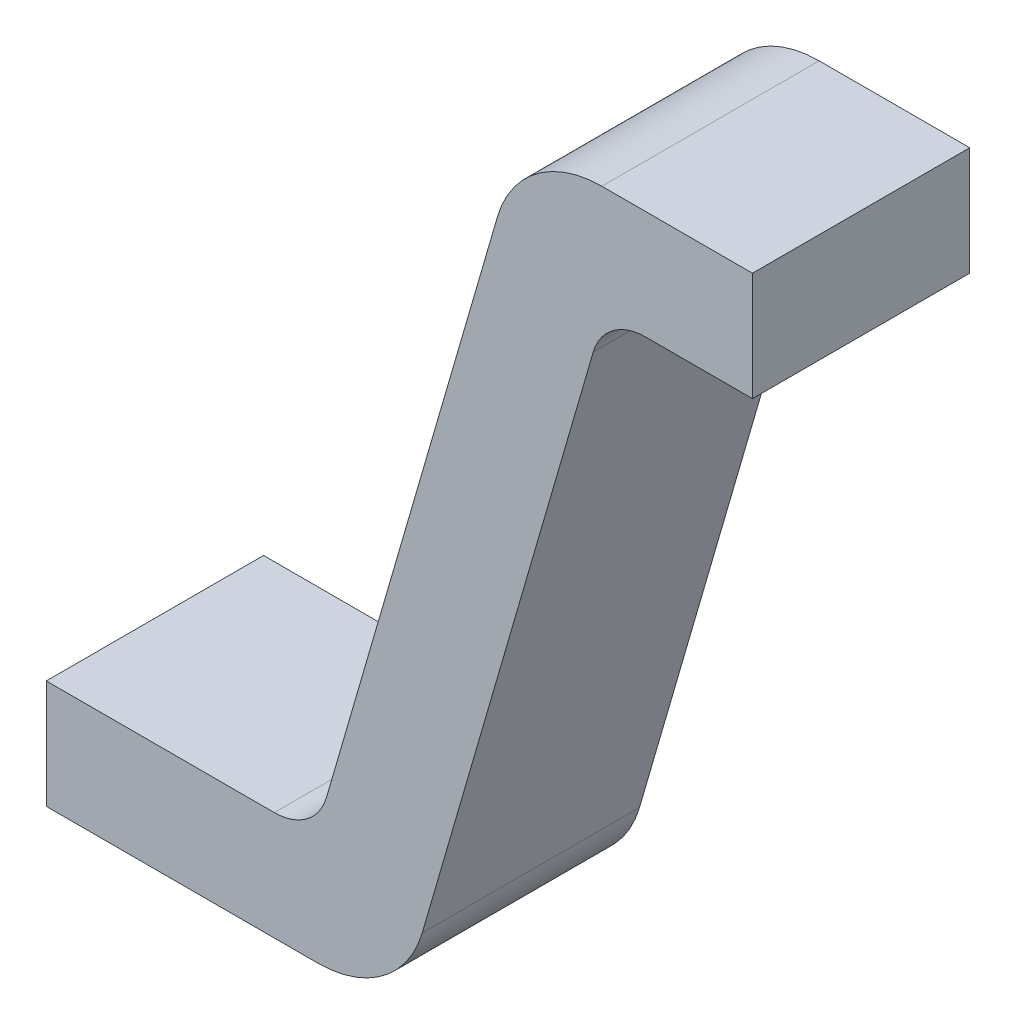
ISO-10303-21;
HEADER;
FILE_DESCRIPTION(('STEP AP214'),'2;1');
FILE_NAME('part.step','',(''),(''),'','','');
FILE_SCHEMA(('AUTOMOTIVE_DESIGN { 1 0 10303 214 1 1 1 1 }'));
ENDSEC;
DATA;
#1=APPLICATION_CONTEXT('core data for automotive mechanical design processes');
#2=APPLICATION_PROTOCOL_DEFINITION('international standard','automotive_design',2000,#1);
#3=PRODUCT_CONTEXT('',#1,'mechanical');
#4=PRODUCT('Part','Part','',(#3));
#5=PRODUCT_RELATED_PRODUCT_CATEGORY('part','',(#4));
#6=PRODUCT_DEFINITION_FORMATION('','',#4);
#7=PRODUCT_DEFINITION_CONTEXT('part definition',#1,'design');
#8=PRODUCT_DEFINITION('design','',#6,#7);
#9=PRODUCT_DEFINITION_SHAPE('','',#8);
#10=(LENGTH_UNIT() NAMED_UNIT(*) SI_UNIT(.MILLI.,.METRE.));
#11=(NAMED_UNIT(*) PLANE_ANGLE_UNIT() SI_UNIT($,.RADIAN.));
#12=(NAMED_UNIT(*) SI_UNIT($,.STERADIAN.) SOLID_ANGLE_UNIT());
#13=UNCERTAINTY_MEASURE_WITH_UNIT(LENGTH_MEASURE(1.E-05),#10,'distance_accuracy_value','');
#14=(GEOMETRIC_REPRESENTATION_CONTEXT(3) GLOBAL_UNCERTAINTY_ASSIGNED_CONTEXT((#13)) GLOBAL_UNIT_ASSIGNED_CONTEXT((#10,
#11,#12)) REPRESENTATION_CONTEXT('',''));
#15=CARTESIAN_POINT('',(0.,0.,0.));
#16=DIRECTION('',(0.,0.,1.));
#17=DIRECTION('',(1.,0.,0.));
#18=AXIS2_PLACEMENT_3D('',#15,#16,#17);
#19=CARTESIAN_POINT('',(0.419807135826594,0.3,0.));
#20=DIRECTION('',(0.,0.,-1.));
#21=DIRECTION('',(-1.,0.,0.));
#22=AXIS2_PLACEMENT_3D('',#19,#20,#21);
#23=PLANE('',#22);
#24=DIRECTION('',(0.,1.,0.));
#25=VECTOR('',#24,1.);
#26=CARTESIAN_POINT('',(0.,0.2,0.));
#27=LINE('',#26,#25);
#28=CARTESIAN_POINT('',(0.,0.,0.));
#29=VERTEX_POINT('',#28);
#30=CARTESIAN_POINT('',(0.,0.2,0.));
#31=VERTEX_POINT('',#30);
#32=EDGE_CURVE('E122',#29,#31,#27,.T.);
#33=ORIENTED_EDGE('',*,*,#32,.T.);
#34=DIRECTION('',(1.,0.,0.));
#35=VECTOR('',#34,1.);
#36=CARTESIAN_POINT('',(0.419807135826594,0.2,0.));
#37=LINE('',#36,#35);
#38=CARTESIAN_POINT('',(0.419807135826594,0.2,0.));
#39=VERTEX_POINT('',#38);
#40=EDGE_CURVE('E116',#31,#39,#37,.T.);
#41=ORIENTED_EDGE('',*,*,#40,.T.);
#42=CARTESIAN_POINT('',(0.419807135826594,0.3,0.));
#43=DIRECTION('',(0.,0.,-1.));
#44=DIRECTION('',(-1.,0.,0.));
#45=AXIS2_PLACEMENT_3D('',#42,#43,#44);
#46=CIRCLE('',#45,0.1);
#47=CARTESIAN_POINT('',(0.515835065958369,0.272095938743494,0.));
#48=VERTEX_POINT('',#47);
#49=EDGE_CURVE('E103',#39,#48,#46,.F.);
#50=ORIENTED_EDGE('',*,*,#49,.T.);
#51=DIRECTION('',(0.279040612565064,0.960279301317754,0.));
#52=VECTOR('',#51,1.);
#53=CARTESIAN_POINT('',(0.830743146543152,1.35580812251301,0.));
#54=LINE('',#53,#52);
#55=CARTESIAN_POINT('',(0.830743146543152,1.35580812251301,0.));
#56=VERTEX_POINT('',#55);
#57=EDGE_CURVE('E100',#48,#56,#54,.T.);
#58=ORIENTED_EDGE('',*,*,#57,.T.);
#59=CARTESIAN_POINT('',(1.0227990068067,1.3,0.));
#60=DIRECTION('',(0.,0.,-1.));
#61=DIRECTION('',(-1.,0.,0.));
#62=AXIS2_PLACEMENT_3D('',#59,#60,#61);
#63=CIRCLE('',#62,0.2);
#64=CARTESIAN_POINT('',(1.0227990068067,1.5,0.));
#65=VERTEX_POINT('',#64);
#66=EDGE_CURVE('E19',#65,#56,#63,.F.);
#67=ORIENTED_EDGE('',*,*,#66,.F.);
#68=DIRECTION('',(1.,0.,0.));
#69=VECTOR('',#68,1.);
#70=CARTESIAN_POINT('',(1.3,1.5,0.));
#71=LINE('',#70,#69);
#72=CARTESIAN_POINT('',(1.3,1.5,0.));
#73=VERTEX_POINT('',#72);
#74=EDGE_CURVE('E112',#65,#73,#71,.T.);
#75=ORIENTED_EDGE('',*,*,#74,.T.);
#76=DIRECTION('',(0.,1.,0.));
#77=VECTOR('',#76,1.);
#78=CARTESIAN_POINT('',(1.3,1.3,0.));
#79=LINE('',#78,#77);
#80=CARTESIAN_POINT('',(1.3,1.3,0.));
#81=VERTEX_POINT('',#80);
#82=EDGE_CURVE('E144',#73,#81,#79,.F.);
#83=ORIENTED_EDGE('',*,*,#82,.T.);
#84=DIRECTION('',(1.,0.,0.));
#85=VECTOR('',#84,1.);
#86=CARTESIAN_POINT('',(1.10299187098011,1.3,0.));
#87=LINE('',#86,#85);
#88=CARTESIAN_POINT('',(1.10299187098011,1.3,0.));
#89=VERTEX_POINT('',#88);
#90=EDGE_CURVE('E138',#81,#89,#87,.F.);
#91=ORIENTED_EDGE('',*,*,#90,.T.);
#92=CARTESIAN_POINT('',(1.10299187098011,1.2,0.));
#93=DIRECTION('',(0.,0.,-1.));
#94=DIRECTION('',(-1.,0.,0.));
#95=AXIS2_PLACEMENT_3D('',#92,#93,#94);
#96=CIRCLE('',#95,0.1);
#97=CARTESIAN_POINT('',(1.00696394084833,1.22790406125651,0.));
#98=VERTEX_POINT('',#97);
#99=EDGE_CURVE('E167',#89,#98,#96,.F.);
#100=ORIENTED_EDGE('',*,*,#99,.T.);
#101=DIRECTION('',(-0.279040612565064,-0.960279301317754,0.));
#102=VECTOR('',#101,1.);
#103=CARTESIAN_POINT('',(0.692055860263551,0.144191877486987,0.));
#104=LINE('',#103,#102);
#105=CARTESIAN_POINT('',(0.692055860263551,0.144191877486987,0.));
#106=VERTEX_POINT('',#105);
#107=EDGE_CURVE('E133',#98,#106,#104,.T.);
#108=ORIENTED_EDGE('',*,*,#107,.T.);
#109=CARTESIAN_POINT('',(0.5,0.2,0.));
#110=DIRECTION('',(0.,0.,-1.));
#111=DIRECTION('',(-1.,0.,0.));
#112=AXIS2_PLACEMENT_3D('',#109,#110,#111);
#113=CIRCLE('',#112,0.2);
#114=CARTESIAN_POINT('',(0.5,0.,0.));
#115=VERTEX_POINT('',#114);
#116=EDGE_CURVE('E136',#115,#106,#113,.F.);
#117=ORIENTED_EDGE('',*,*,#116,.F.);
#118=DIRECTION('',(1.,0.,0.));
#119=VECTOR('',#118,1.);
#120=CARTESIAN_POINT('',(0.,0.,0.));
#121=LINE('',#120,#119);
#122=EDGE_CURVE('E127',#115,#29,#121,.F.);
#123=ORIENTED_EDGE('',*,*,#122,.T.);
#124=EDGE_LOOP('',(#33,#41,#50,#58,#67,#75,#83,#91,#100,#108,#117,#123));
#125=FACE_BOUND('',#124,.T.);
#126=ADVANCED_FACE('F16',(#125),#23,.T.);
#127=CARTESIAN_POINT('',(0.830743146543152,1.35580812251301,0.4));
#128=DIRECTION('',(0.960279301317754,-0.279040612565064,0.));
#129=DIRECTION('',(0.279040612565064,0.960279301317754,0.));
#130=AXIS2_PLACEMENT_3D('',#127,#128,#129);
#131=PLANE('',#130);
#132=DIRECTION('',(0.,0.,-1.));
#133=VECTOR('',#132,1.);
#134=CARTESIAN_POINT('',(0.515835065958369,0.272095938743494,0.4));
#135=LINE('',#134,#133);
#136=CARTESIAN_POINT('',(0.515835065958369,0.272095938743494,0.4));
#137=VERTEX_POINT('',#136);
#138=EDGE_CURVE('E118',#48,#137,#135,.F.);
#139=ORIENTED_EDGE('',*,*,#138,.T.);
#140=DIRECTION('',(0.279040612565064,0.960279301317754,0.));
#141=VECTOR('',#140,1.);
#142=CARTESIAN_POINT('',(0.515835065958369,0.272095938743494,0.4));
#143=LINE('',#142,#141);
#144=CARTESIAN_POINT('',(0.830743146543152,1.35580812251301,0.4));
#145=VERTEX_POINT('',#144);
#146=EDGE_CURVE('E110',#137,#145,#143,.T.);
#147=ORIENTED_EDGE('',*,*,#146,.T.);
#148=DIRECTION('',(0.,0.,-1.));
#149=VECTOR('',#148,1.);
#150=CARTESIAN_POINT('',(0.830743146543152,1.35580812251301,0.4));
#151=LINE('',#150,#149);
#152=EDGE_CURVE('E97',#56,#145,#151,.F.);
#153=ORIENTED_EDGE('',*,*,#152,.F.);
#154=ORIENTED_EDGE('',*,*,#57,.F.);
#155=EDGE_LOOP('',(#139,#147,#153,#154));
#156=FACE_BOUND('',#155,.T.);
#157=ADVANCED_FACE('F109',(#156),#131,.F.);
#158=CARTESIAN_POINT('',(1.0227990068067,1.3,0.4));
#159=DIRECTION('',(0.,0.,-1.));
#160=DIRECTION('',(-1.,0.,0.));
#161=AXIS2_PLACEMENT_3D('',#158,#159,#160);
#162=CYLINDRICAL_SURFACE('',#161,0.2);
#163=CARTESIAN_POINT('',(1.0227990068067,1.3,0.4));
#164=DIRECTION('',(0.,0.,-1.));
#165=DIRECTION('',(-1.,0.,0.));
#166=AXIS2_PLACEMENT_3D('',#163,#164,#165);
#167=CIRCLE('',#166,0.2);
#168=CARTESIAN_POINT('',(1.0227990068067,1.5,0.4));
#169=VERTEX_POINT('',#168);
#170=EDGE_CURVE('E162',#145,#169,#167,.T.);
#171=ORIENTED_EDGE('',*,*,#170,.T.);
#172=DIRECTION('',(0.,0.,-1.));
#173=VECTOR('',#172,1.);
#174=CARTESIAN_POINT('',(1.0227990068067,1.5,0.4));
#175=LINE('',#174,#173);
#176=EDGE_CURVE('E99',#169,#65,#175,.T.);
#177=ORIENTED_EDGE('',*,*,#176,.T.);
#178=ORIENTED_EDGE('',*,*,#66,.T.);
#179=ORIENTED_EDGE('',*,*,#152,.T.);
#180=EDGE_LOOP('',(#171,#177,#178,#179));
#181=FACE_BOUND('',#180,.T.);
#182=ADVANCED_FACE('F95',(#181),#162,.T.);
#183=CARTESIAN_POINT('',(1.3,1.5,0.4));
#184=DIRECTION('',(0.,-1.,0.));
#185=DIRECTION('',(0.,0.,-1.));
#186=AXIS2_PLACEMENT_3D('',#183,#184,#185);
#187=PLANE('',#186);
#188=ORIENTED_EDGE('',*,*,#176,.F.);
#189=DIRECTION('',(-1.,0.,0.));
#190=VECTOR('',#189,1.);
#191=CARTESIAN_POINT('',(0.419807135826594,1.5,0.4));
#192=LINE('',#191,#190);
#193=CARTESIAN_POINT('',(1.3,1.5,0.4));
#194=VERTEX_POINT('',#193);
#195=EDGE_CURVE('E164',#169,#194,#192,.F.);
#196=ORIENTED_EDGE('',*,*,#195,.T.);
#197=DIRECTION('',(0.,0.,1.));
#198=VECTOR('',#197,1.);
#199=CARTESIAN_POINT('',(1.3,1.5,0.4));
#200=LINE('',#199,#198);
#201=EDGE_CURVE('E147',#194,#73,#200,.F.);
#202=ORIENTED_EDGE('',*,*,#201,.T.);
#203=ORIENTED_EDGE('',*,*,#74,.F.);
#204=EDGE_LOOP('',(#188,#196,#202,#203));
#205=FACE_BOUND('',#204,.T.);
#206=ADVANCED_FACE('F193',(#205),#187,.F.);
#207=CARTESIAN_POINT('',(1.3,1.3,0.4));
#208=DIRECTION('',(-1.,0.,0.));
#209=DIRECTION('',(0.,0.,1.));
#210=AXIS2_PLACEMENT_3D('',#207,#208,#209);
#211=PLANE('',#210);
#212=ORIENTED_EDGE('',*,*,#201,.F.);
#213=DIRECTION('',(0.,1.,0.));
#214=VECTOR('',#213,1.);
#215=CARTESIAN_POINT('',(1.3,0.3,0.4));
#216=LINE('',#215,#214);
#217=CARTESIAN_POINT('',(1.3,1.3,0.4));
#218=VERTEX_POINT('',#217);
#219=EDGE_CURVE('E183',#194,#218,#216,.F.);
#220=ORIENTED_EDGE('',*,*,#219,.T.);
#221=DIRECTION('',(0.,0.,1.));
#222=VECTOR('',#221,1.);
#223=CARTESIAN_POINT('',(1.3,1.3,0.4));
#224=LINE('',#223,#222);
#225=EDGE_CURVE('E141',#218,#81,#224,.F.);
#226=ORIENTED_EDGE('',*,*,#225,.T.);
#227=ORIENTED_EDGE('',*,*,#82,.F.);
#228=EDGE_LOOP('',(#212,#220,#226,#227));
#229=FACE_BOUND('',#228,.T.);
#230=ADVANCED_FACE('F198',(#229),#211,.F.);
#231=CARTESIAN_POINT('',(1.10299187098011,1.3,0.4));
#232=DIRECTION('',(0.,1.,0.));
#233=DIRECTION('',(0.,0.,1.));
#234=AXIS2_PLACEMENT_3D('',#231,#232,#233);
#235=PLANE('',#234);
#236=ORIENTED_EDGE('',*,*,#225,.F.);
#237=DIRECTION('',(-1.,0.,0.));
#238=VECTOR('',#237,1.);
#239=CARTESIAN_POINT('',(0.419807135826594,1.3,0.4));
#240=LINE('',#239,#238);
#241=CARTESIAN_POINT('',(1.10299187098011,1.3,0.4));
#242=VERTEX_POINT('',#241);
#243=EDGE_CURVE('E161',#218,#242,#240,.T.);
#244=ORIENTED_EDGE('',*,*,#243,.T.);
#245=DIRECTION('',(0.,0.,-1.));
#246=VECTOR('',#245,1.);
#247=CARTESIAN_POINT('',(1.10299187098011,1.3,0.4));
#248=LINE('',#247,#246);
#249=EDGE_CURVE('E140',#242,#89,#248,.T.);
#250=ORIENTED_EDGE('',*,*,#249,.T.);
#251=ORIENTED_EDGE('',*,*,#90,.F.);
#252=EDGE_LOOP('',(#236,#244,#250,#251));
#253=FACE_BOUND('',#252,.T.);
#254=ADVANCED_FACE('F246',(#253),#235,.F.);
#255=CARTESIAN_POINT('',(1.10299187098011,1.2,0.4));
#256=DIRECTION('',(0.,0.,-1.));
#257=DIRECTION('',(-1.,0.,0.));
#258=AXIS2_PLACEMENT_3D('',#255,#256,#257);
#259=CYLINDRICAL_SURFACE('',#258,0.1);
#260=ORIENTED_EDGE('',*,*,#249,.F.);
#261=CARTESIAN_POINT('',(1.10299187098011,1.2,0.4));
#262=DIRECTION('',(0.,0.,-1.));
#263=DIRECTION('',(-1.,0.,0.));
#264=AXIS2_PLACEMENT_3D('',#261,#262,#263);
#265=CIRCLE('',#264,0.1);
#266=CARTESIAN_POINT('',(1.00696394084833,1.22790406125651,0.4));
#267=VERTEX_POINT('',#266);
#268=EDGE_CURVE('E158',#242,#267,#265,.F.);
#269=ORIENTED_EDGE('',*,*,#268,.T.);
#270=DIRECTION('',(0.,0.,1.));
#271=VECTOR('',#270,1.);
#272=CARTESIAN_POINT('',(1.00696394084833,1.22790406125651,0.4));
#273=LINE('',#272,#271);
#274=EDGE_CURVE('E137',#267,#98,#273,.F.);
#275=ORIENTED_EDGE('',*,*,#274,.T.);
#276=ORIENTED_EDGE('',*,*,#99,.F.);
#277=EDGE_LOOP('',(#260,#269,#275,#276));
#278=FACE_BOUND('',#277,.T.);
#279=ADVANCED_FACE('F244',(#278),#259,.F.);
#280=CARTESIAN_POINT('',(0.692055860263551,0.144191877486987,0.4));
#281=DIRECTION('',(-0.960279301317754,0.279040612565064,0.));
#282=DIRECTION('',(-0.279040612565064,-0.960279301317754,0.));
#283=AXIS2_PLACEMENT_3D('',#280,#281,#282);
#284=PLANE('',#283);
#285=ORIENTED_EDGE('',*,*,#274,.F.);
#286=DIRECTION('',(-0.279040612565064,-0.960279301317754,0.));
#287=VECTOR('',#286,1.);
#288=CARTESIAN_POINT('',(1.00696394084833,1.22790406125651,0.4));
#289=LINE('',#288,#287);
#290=CARTESIAN_POINT('',(0.692055860263551,0.144191877486987,0.4));
#291=VERTEX_POINT('',#290);
#292=EDGE_CURVE('E157',#267,#291,#289,.T.);
#293=ORIENTED_EDGE('',*,*,#292,.T.);
#294=DIRECTION('',(0.,0.,-1.));
#295=VECTOR('',#294,1.);
#296=CARTESIAN_POINT('',(0.692055860263551,0.144191877486987,0.4));
#297=LINE('',#296,#295);
#298=EDGE_CURVE('E166',#106,#291,#297,.F.);
#299=ORIENTED_EDGE('',*,*,#298,.F.);
#300=ORIENTED_EDGE('',*,*,#107,.F.);
#301=EDGE_LOOP('',(#285,#293,#299,#300));
#302=FACE_BOUND('',#301,.T.);
#303=ADVANCED_FACE('F242',(#302),#284,.F.);
#304=CARTESIAN_POINT('',(0.5,0.2,0.4));
#305=DIRECTION('',(0.,0.,-1.));
#306=DIRECTION('',(-1.,0.,0.));
#307=AXIS2_PLACEMENT_3D('',#304,#305,#306);
#308=CYLINDRICAL_SURFACE('',#307,0.2);
#309=CARTESIAN_POINT('',(0.5,0.2,0.4));
#310=DIRECTION('',(0.,0.,-1.));
#311=DIRECTION('',(-1.,0.,0.));
#312=AXIS2_PLACEMENT_3D('',#309,#310,#311);
#313=CIRCLE('',#312,0.2);
#314=CARTESIAN_POINT('',(0.5,0.,0.4));
#315=VERTEX_POINT('',#314);
#316=EDGE_CURVE('E153',#291,#315,#313,.T.);
#317=ORIENTED_EDGE('',*,*,#316,.T.);
#318=DIRECTION('',(0.,0.,1.));
#319=VECTOR('',#318,1.);
#320=CARTESIAN_POINT('',(0.5,0.,0.4));
#321=LINE('',#320,#319);
#322=EDGE_CURVE('E130',#315,#115,#321,.F.);
#323=ORIENTED_EDGE('',*,*,#322,.T.);
#324=ORIENTED_EDGE('',*,*,#116,.T.);
#325=ORIENTED_EDGE('',*,*,#298,.T.);
#326=EDGE_LOOP('',(#317,#323,#324,#325));
#327=FACE_BOUND('',#326,.T.);
#328=ADVANCED_FACE('F236',(#327),#308,.T.);
#329=CARTESIAN_POINT('',(0.,0.,0.4));
#330=DIRECTION('',(0.,1.,0.));
#331=DIRECTION('',(0.,0.,1.));
#332=AXIS2_PLACEMENT_3D('',#329,#330,#331);
#333=PLANE('',#332);
#334=ORIENTED_EDGE('',*,*,#322,.F.);
#335=DIRECTION('',(-1.,0.,0.));
#336=VECTOR('',#335,1.);
#337=CARTESIAN_POINT('',(0.419807135826594,0.,0.4));
#338=LINE('',#337,#336);
#339=CARTESIAN_POINT('',(0.,0.,0.4));
#340=VERTEX_POINT('',#339);
#341=EDGE_CURVE('E156',#315,#340,#338,.T.);
#342=ORIENTED_EDGE('',*,*,#341,.T.);
#343=DIRECTION('',(0.,0.,-1.));
#344=VECTOR('',#343,1.);
#345=CARTESIAN_POINT('',(0.,0.,0.4));
#346=LINE('',#345,#344);
#347=EDGE_CURVE('E124',#340,#29,#346,.T.);
#348=ORIENTED_EDGE('',*,*,#347,.T.);
#349=ORIENTED_EDGE('',*,*,#122,.F.);
#350=EDGE_LOOP('',(#334,#342,#348,#349));
#351=FACE_BOUND('',#350,.T.);
#352=ADVANCED_FACE('F270',(#351),#333,.F.);
#353=CARTESIAN_POINT('',(0.,0.2,0.4));
#354=DIRECTION('',(1.,0.,0.));
#355=DIRECTION('',(0.,0.,-1.));
#356=AXIS2_PLACEMENT_3D('',#353,#354,#355);
#357=PLANE('',#356);
#358=ORIENTED_EDGE('',*,*,#347,.F.);
#359=DIRECTION('',(0.,1.,0.));
#360=VECTOR('',#359,1.);
#361=CARTESIAN_POINT('',(0.,0.3,0.4));
#362=LINE('',#361,#360);
#363=CARTESIAN_POINT('',(0.,0.2,0.4));
#364=VERTEX_POINT('',#363);
#365=EDGE_CURVE('E223',#340,#364,#362,.T.);
#366=ORIENTED_EDGE('',*,*,#365,.T.);
#367=DIRECTION('',(0.,0.,1.));
#368=VECTOR('',#367,1.);
#369=CARTESIAN_POINT('',(0.,0.2,0.4));
#370=LINE('',#369,#368);
#371=EDGE_CURVE('E119',#364,#31,#370,.F.);
#372=ORIENTED_EDGE('',*,*,#371,.T.);
#373=ORIENTED_EDGE('',*,*,#32,.F.);
#374=EDGE_LOOP('',(#358,#366,#372,#373));
#375=FACE_BOUND('',#374,.T.);
#376=ADVANCED_FACE('F266',(#375),#357,.F.);
#377=CARTESIAN_POINT('',(0.419807135826594,0.2,0.4));
#378=DIRECTION('',(0.,-1.,0.));
#379=DIRECTION('',(1.,0.,0.));
#380=AXIS2_PLACEMENT_3D('',#377,#378,#379);
#381=PLANE('',#380);
#382=ORIENTED_EDGE('',*,*,#371,.F.);
#383=DIRECTION('',(-1.,0.,0.));
#384=VECTOR('',#383,1.);
#385=CARTESIAN_POINT('',(0.419807135826594,0.2,0.4));
#386=LINE('',#385,#384);
#387=CARTESIAN_POINT('',(0.419807135826594,0.2,0.4));
#388=VERTEX_POINT('',#387);
#389=EDGE_CURVE('E25',#364,#388,#386,.F.);
#390=ORIENTED_EDGE('',*,*,#389,.T.);
#391=DIRECTION('',(0.,0.,-1.));
#392=VECTOR('',#391,1.);
#393=CARTESIAN_POINT('',(0.419807135826594,0.2,0.4));
#394=LINE('',#393,#392);
#395=EDGE_CURVE('E33',#388,#39,#394,.T.);
#396=ORIENTED_EDGE('',*,*,#395,.T.);
#397=ORIENTED_EDGE('',*,*,#40,.F.);
#398=EDGE_LOOP('',(#382,#390,#396,#397));
#399=FACE_BOUND('',#398,.T.);
#400=ADVANCED_FACE('F261',(#399),#381,.F.);
#401=CARTESIAN_POINT('',(0.419807135826594,0.3,0.4));
#402=DIRECTION('',(0.,0.,-1.));
#403=DIRECTION('',(-1.,0.,0.));
#404=AXIS2_PLACEMENT_3D('',#401,#402,#403);
#405=CYLINDRICAL_SURFACE('',#404,0.1);
#406=ORIENTED_EDGE('',*,*,#395,.F.);
#407=CARTESIAN_POINT('',(0.419807135826594,0.3,0.4));
#408=DIRECTION('',(0.,0.,-1.));
#409=DIRECTION('',(-1.,0.,0.));
#410=AXIS2_PLACEMENT_3D('',#407,#408,#409);
#411=CIRCLE('',#410,0.1);
#412=EDGE_CURVE('E11',#388,#137,#411,.F.);
#413=ORIENTED_EDGE('',*,*,#412,.T.);
#414=ORIENTED_EDGE('',*,*,#138,.F.);
#415=ORIENTED_EDGE('',*,*,#49,.F.);
#416=EDGE_LOOP('',(#406,#413,#414,#415));
#417=FACE_BOUND('',#416,.T.);
#418=ADVANCED_FACE('F256',(#417),#405,.F.);
#419=CARTESIAN_POINT('',(0.419807135826594,0.3,0.4));
#420=DIRECTION('',(0.,0.,-1.));
#421=DIRECTION('',(-1.,0.,0.));
#422=AXIS2_PLACEMENT_3D('',#419,#420,#421);
#423=PLANE('',#422);
#424=ORIENTED_EDGE('',*,*,#389,.F.);
#425=ORIENTED_EDGE('',*,*,#365,.F.);
#426=ORIENTED_EDGE('',*,*,#341,.F.);
#427=ORIENTED_EDGE('',*,*,#316,.F.);
#428=ORIENTED_EDGE('',*,*,#292,.F.);
#429=ORIENTED_EDGE('',*,*,#268,.F.);
#430=ORIENTED_EDGE('',*,*,#243,.F.);
#431=ORIENTED_EDGE('',*,*,#219,.F.);
#432=ORIENTED_EDGE('',*,*,#195,.F.);
#433=ORIENTED_EDGE('',*,*,#170,.F.);
#434=ORIENTED_EDGE('',*,*,#146,.F.);
#435=ORIENTED_EDGE('',*,*,#412,.F.);
#436=EDGE_LOOP('',(#424,#425,#426,#427,#428,#429,#430,#431,#432,#433,#434,#435));
#437=FACE_BOUND('',#436,.T.);
#438=ADVANCED_FACE('F202',(#437),#423,.F.);
#439=CLOSED_SHELL('',(#126,#157,#182,#206,#230,#254,#279,#303,#328,#352,#376,#400,#418,#438));
#440=MANIFOLD_SOLID_BREP('B1',#439);
#441=ADVANCED_BREP_SHAPE_REPRESENTATION('',(#18,#440),#14);
#442=SHAPE_DEFINITION_REPRESENTATION(#9,#441);
ENDSEC;
END-ISO-10303-21;
